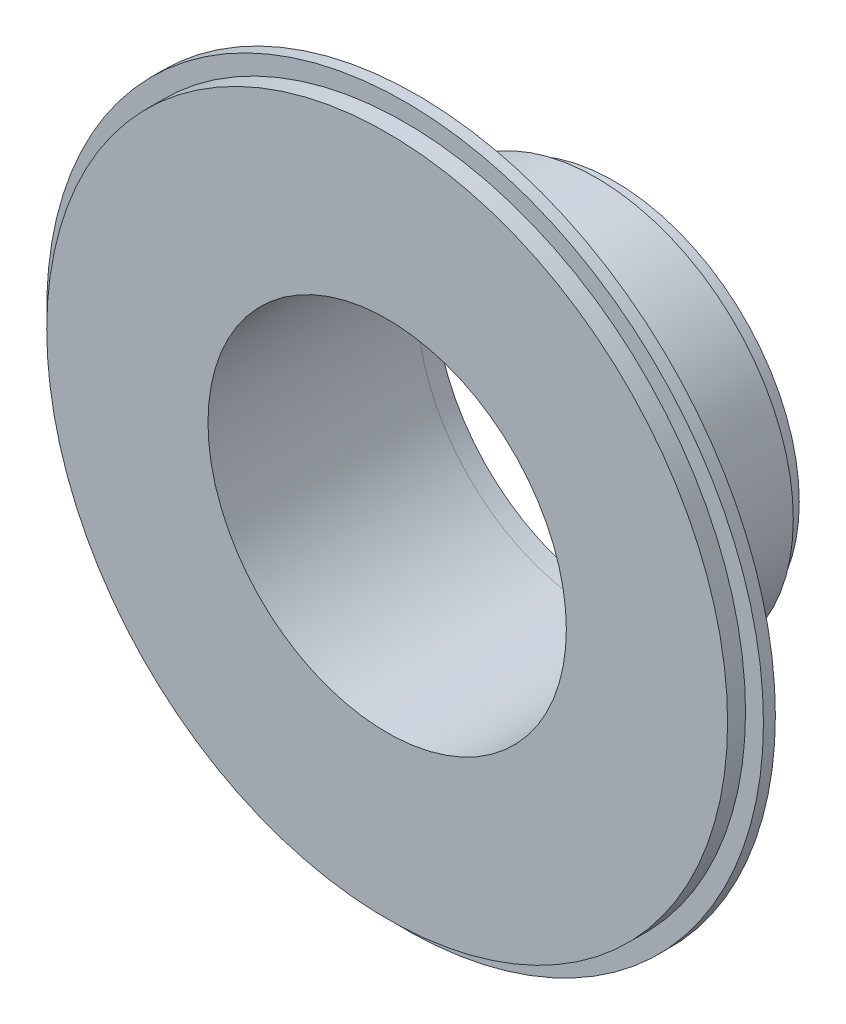
ISO-10303-21;
HEADER;
FILE_DESCRIPTION(('STEP AP214'),'2;1');
FILE_NAME('part.step','',(''),(''),'','','');
FILE_SCHEMA(('AUTOMOTIVE_DESIGN { 1 0 10303 214 1 1 1 1 }'));
ENDSEC;
DATA;
#1=APPLICATION_CONTEXT('core data for automotive mechanical design processes');
#2=APPLICATION_PROTOCOL_DEFINITION('international standard','automotive_design',2000,#1);
#3=PRODUCT_CONTEXT('',#1,'mechanical');
#4=PRODUCT('Part','Part','',(#3));
#5=PRODUCT_RELATED_PRODUCT_CATEGORY('part','',(#4));
#6=PRODUCT_DEFINITION_FORMATION('','',#4);
#7=PRODUCT_DEFINITION_CONTEXT('part definition',#1,'design');
#8=PRODUCT_DEFINITION('design','',#6,#7);
#9=PRODUCT_DEFINITION_SHAPE('','',#8);
#10=(LENGTH_UNIT() NAMED_UNIT(*) SI_UNIT(.MILLI.,.METRE.));
#11=(NAMED_UNIT(*) PLANE_ANGLE_UNIT() SI_UNIT($,.RADIAN.));
#12=(NAMED_UNIT(*) SI_UNIT($,.STERADIAN.) SOLID_ANGLE_UNIT());
#13=UNCERTAINTY_MEASURE_WITH_UNIT(LENGTH_MEASURE(1.E-05),#10,'distance_accuracy_value','');
#14=(GEOMETRIC_REPRESENTATION_CONTEXT(3) GLOBAL_UNCERTAINTY_ASSIGNED_CONTEXT((#13)) GLOBAL_UNIT_ASSIGNED_CONTEXT((#10,
#11,#12)) REPRESENTATION_CONTEXT('',''));
#15=CARTESIAN_POINT('',(0.,0.,0.));
#16=DIRECTION('',(0.,0.,1.));
#17=DIRECTION('',(1.,0.,0.));
#18=AXIS2_PLACEMENT_3D('',#15,#16,#17);
#19=CARTESIAN_POINT('',(0.,0.,35.));
#20=DIRECTION('',(0.,0.,-1.));
#21=DIRECTION('',(-1.,0.,0.));
#22=AXIS2_PLACEMENT_3D('',#19,#20,#21);
#23=CYLINDRICAL_SURFACE('',#22,60.);
#24=CARTESIAN_POINT('',(0.,0.,30.));
#25=DIRECTION('',(0.,0.,1.));
#26=DIRECTION('',(1.,0.,0.));
#27=AXIS2_PLACEMENT_3D('',#24,#25,#26);
#28=CIRCLE('',#27,60.);
#29=CARTESIAN_POINT('',(60.,0.,30.));
#30=VERTEX_POINT('',#29);
#31=EDGE_CURVE('E62',#30,#30,#28,.T.);
#32=ORIENTED_EDGE('',*,*,#31,.T.);
#33=EDGE_LOOP('',(#32));
#34=FACE_BOUND('',#33,.T.);
#35=CARTESIAN_POINT('',(0.,0.,32.));
#36=DIRECTION('',(0.,0.,1.));
#37=DIRECTION('',(1.,0.,0.));
#38=AXIS2_PLACEMENT_3D('',#35,#36,#37);
#39=CIRCLE('',#38,60.);
#40=CARTESIAN_POINT('',(60.,0.,32.));
#41=VERTEX_POINT('',#40);
#42=EDGE_CURVE('E72',#41,#41,#39,.T.);
#43=ORIENTED_EDGE('',*,*,#42,.F.);
#44=EDGE_LOOP('',(#43));
#45=FACE_BOUND('',#44,.T.);
#46=ADVANCED_FACE('F48',(#34,#45),#23,.T.);
#47=CARTESIAN_POINT('',(0.,0.,35.));
#48=DIRECTION('',(0.,0.,1.));
#49=DIRECTION('',(1.,0.,0.));
#50=AXIS2_PLACEMENT_3D('',#47,#48,#49);
#51=PLANE('',#50);
#52=CARTESIAN_POINT('',(0.,0.,35.));
#53=DIRECTION('',(0.,0.,1.));
#54=DIRECTION('',(1.,0.,0.));
#55=AXIS2_PLACEMENT_3D('',#52,#53,#54);
#56=CIRCLE('',#55,30.);
#57=CARTESIAN_POINT('',(30.,0.,35.));
#58=VERTEX_POINT('',#57);
#59=EDGE_CURVE('E65',#58,#58,#56,.F.);
#60=ORIENTED_EDGE('',*,*,#59,.T.);
#61=EDGE_LOOP('',(#60));
#62=FACE_BOUND('',#61,.T.);
#63=CARTESIAN_POINT('',(0.,0.,35.));
#64=DIRECTION('',(0.,0.,1.));
#65=DIRECTION('',(1.,0.,0.));
#66=AXIS2_PLACEMENT_3D('',#63,#64,#65);
#67=CIRCLE('',#66,57.);
#68=CARTESIAN_POINT('',(57.,0.,35.));
#69=VERTEX_POINT('',#68);
#70=EDGE_CURVE('E77',#69,#69,#67,.T.);
#71=ORIENTED_EDGE('',*,*,#70,.T.);
#72=EDGE_LOOP('',(#71));
#73=FACE_BOUND('',#72,.T.);
#74=ADVANCED_FACE('F94',(#62,#73),#51,.T.);
#75=CARTESIAN_POINT('',(0.,0.,30.));
#76=DIRECTION('',(0.,0.,-1.));
#77=DIRECTION('',(-1.,0.,0.));
#78=AXIS2_PLACEMENT_3D('',#75,#76,#77);
#79=CYLINDRICAL_SURFACE('',#78,33.);
#80=CARTESIAN_POINT('',(0.,0.,30.));
#81=DIRECTION('',(0.,0.,1.));
#82=DIRECTION('',(1.,0.,0.));
#83=AXIS2_PLACEMENT_3D('',#80,#81,#82);
#84=CIRCLE('',#83,33.);
#85=CARTESIAN_POINT('',(33.,0.,30.));
#86=VERTEX_POINT('',#85);
#87=EDGE_CURVE('E12',#86,#86,#84,.T.);
#88=ORIENTED_EDGE('',*,*,#87,.F.);
#89=EDGE_LOOP('',(#88));
#90=FACE_BOUND('',#89,.T.);
#91=CARTESIAN_POINT('',(0.,0.,0.));
#92=DIRECTION('',(0.,0.,1.));
#93=DIRECTION('',(1.,0.,0.));
#94=AXIS2_PLACEMENT_3D('',#91,#92,#93);
#95=CIRCLE('',#94,33.);
#96=CARTESIAN_POINT('',(33.,0.,0.));
#97=VERTEX_POINT('',#96);
#98=EDGE_CURVE('E60',#97,#97,#95,.T.);
#99=ORIENTED_EDGE('',*,*,#98,.T.);
#100=EDGE_LOOP('',(#99));
#101=FACE_BOUND('',#100,.T.);
#102=ADVANCED_FACE('F50',(#90,#101),#79,.T.);
#103=CARTESIAN_POINT('',(0.,0.,30.));
#104=DIRECTION('',(0.,0.,-1.));
#105=DIRECTION('',(-1.,0.,0.));
#106=AXIS2_PLACEMENT_3D('',#103,#104,#105);
#107=CYLINDRICAL_SURFACE('',#106,30.);
#108=CARTESIAN_POINT('',(0.,0.,0.));
#109=DIRECTION('',(0.,0.,1.));
#110=DIRECTION('',(1.,0.,0.));
#111=AXIS2_PLACEMENT_3D('',#108,#109,#110);
#112=CIRCLE('',#111,30.);
#113=CARTESIAN_POINT('',(30.,0.,0.));
#114=VERTEX_POINT('',#113);
#115=EDGE_CURVE('E52',#114,#114,#112,.F.);
#116=ORIENTED_EDGE('',*,*,#115,.T.);
#117=EDGE_LOOP('',(#116));
#118=FACE_BOUND('',#117,.T.);
#119=ORIENTED_EDGE('',*,*,#59,.F.);
#120=EDGE_LOOP('',(#119));
#121=FACE_BOUND('',#120,.T.);
#122=ADVANCED_FACE('F105',(#118,#121),#107,.F.);
#123=CARTESIAN_POINT('',(0.,0.,0.));
#124=DIRECTION('',(0.,0.,1.));
#125=DIRECTION('',(1.,0.,0.));
#126=AXIS2_PLACEMENT_3D('',#123,#124,#125);
#127=PLANE('',#126);
#128=ORIENTED_EDGE('',*,*,#98,.F.);
#129=EDGE_LOOP('',(#128));
#130=FACE_BOUND('',#129,.T.);
#131=ORIENTED_EDGE('',*,*,#115,.F.);
#132=EDGE_LOOP('',(#131));
#133=FACE_BOUND('',#132,.T.);
#134=ADVANCED_FACE('F103',(#130,#133),#127,.F.);
#135=CARTESIAN_POINT('',(0.,0.,30.));
#136=DIRECTION('',(0.,0.,1.));
#137=DIRECTION('',(1.,0.,0.));
#138=AXIS2_PLACEMENT_3D('',#135,#136,#137);
#139=PLANE('',#138);
#140=ORIENTED_EDGE('',*,*,#87,.T.);
#141=EDGE_LOOP('',(#140));
#142=FACE_BOUND('',#141,.T.);
#143=ORIENTED_EDGE('',*,*,#31,.F.);
#144=EDGE_LOOP('',(#143));
#145=FACE_BOUND('',#144,.T.);
#146=ADVANCED_FACE('F89',(#142,#145),#139,.F.);
#147=CARTESIAN_POINT('',(0.,0.,32.));
#148=DIRECTION('',(0.,0.,1.));
#149=DIRECTION('',(1.,0.,0.));
#150=AXIS2_PLACEMENT_3D('',#147,#148,#149);
#151=PLANE('',#150);
#152=CARTESIAN_POINT('',(0.,0.,32.));
#153=DIRECTION('',(0.,0.,1.));
#154=DIRECTION('',(1.,0.,0.));
#155=AXIS2_PLACEMENT_3D('',#152,#153,#154);
#156=CIRCLE('',#155,57.);
#157=CARTESIAN_POINT('',(57.,0.,32.));
#158=VERTEX_POINT('',#157);
#159=EDGE_CURVE('E76',#158,#158,#156,.T.);
#160=ORIENTED_EDGE('',*,*,#159,.F.);
#161=EDGE_LOOP('',(#160));
#162=FACE_BOUND('',#161,.T.);
#163=ORIENTED_EDGE('',*,*,#42,.T.);
#164=EDGE_LOOP('',(#163));
#165=FACE_BOUND('',#164,.T.);
#166=ADVANCED_FACE('F86',(#162,#165),#151,.T.);
#167=CARTESIAN_POINT('',(0.,0.,32.));
#168=DIRECTION('',(0.,0.,1.));
#169=DIRECTION('',(1.,0.,0.));
#170=AXIS2_PLACEMENT_3D('',#167,#168,#169);
#171=CYLINDRICAL_SURFACE('',#170,57.);
#172=ORIENTED_EDGE('',*,*,#159,.T.);
#173=EDGE_LOOP('',(#172));
#174=FACE_BOUND('',#173,.T.);
#175=ORIENTED_EDGE('',*,*,#70,.F.);
#176=EDGE_LOOP('',(#175));
#177=FACE_BOUND('',#176,.T.);
#178=ADVANCED_FACE('F83',(#174,#177),#171,.T.);
#179=CLOSED_SHELL('',(#46,#74,#102,#122,#134,#146,#166,#178));
#180=MANIFOLD_SOLID_BREP('B2',#179);
#181=CARTESIAN_POINT('',(0.,0.,-3.));
#182=DIRECTION('',(0.,0.,1.));
#183=DIRECTION('',(1.,0.,0.));
#184=AXIS2_PLACEMENT_3D('',#181,#182,#183);
#185=CYLINDRICAL_SURFACE('',#184,31.);
#186=CARTESIAN_POINT('',(0.,0.,-3.));
#187=DIRECTION('',(0.,0.,1.));
#188=DIRECTION('',(1.,0.,0.));
#189=AXIS2_PLACEMENT_3D('',#186,#187,#188);
#190=CIRCLE('',#189,31.);
#191=CARTESIAN_POINT('',(31.,0.,-3.));
#192=VERTEX_POINT('',#191);
#193=EDGE_CURVE('E47',#192,#192,#190,.T.);
#194=ORIENTED_EDGE('',*,*,#193,.T.);
#195=EDGE_LOOP('',(#194));
#196=FACE_BOUND('',#195,.T.);
#197=CARTESIAN_POINT('',(0.,0.,0.));
#198=DIRECTION('',(0.,0.,1.));
#199=DIRECTION('',(1.,0.,0.));
#200=AXIS2_PLACEMENT_3D('',#197,#198,#199);
#201=CIRCLE('',#200,31.);
#202=CARTESIAN_POINT('',(31.,0.,0.));
#203=VERTEX_POINT('',#202);
#204=EDGE_CURVE('E190',#203,#203,#201,.T.);
#205=ORIENTED_EDGE('',*,*,#204,.F.);
#206=EDGE_LOOP('',(#205));
#207=FACE_BOUND('',#206,.T.);
#208=ADVANCED_FACE('F187',(#196,#207),#185,.T.);
#209=CARTESIAN_POINT('',(0.,0.,-3.));
#210=DIRECTION('',(0.,0.,1.));
#211=DIRECTION('',(1.,0.,0.));
#212=AXIS2_PLACEMENT_3D('',#209,#210,#211);
#213=PLANE('',#212);
#214=CARTESIAN_POINT('',(0.,0.,-3.));
#215=DIRECTION('',(0.,0.,1.));
#216=DIRECTION('',(1.,0.,0.));
#217=AXIS2_PLACEMENT_3D('',#214,#215,#216);
#218=CIRCLE('',#217,30.);
#219=CARTESIAN_POINT('',(30.,0.,-3.));
#220=VERTEX_POINT('',#219);
#221=EDGE_CURVE('E197',#220,#220,#218,.T.);
#222=ORIENTED_EDGE('',*,*,#221,.T.);
#223=EDGE_LOOP('',(#222));
#224=FACE_BOUND('',#223,.T.);
#225=ORIENTED_EDGE('',*,*,#193,.F.);
#226=EDGE_LOOP('',(#225));
#227=FACE_BOUND('',#226,.T.);
#228=ADVANCED_FACE('F205',(#224,#227),#213,.F.);
#229=CARTESIAN_POINT('',(0.,0.,0.));
#230=DIRECTION('',(0.,0.,1.));
#231=DIRECTION('',(1.,0.,0.));
#232=AXIS2_PLACEMENT_3D('',#229,#230,#231);
#233=PLANE('',#232);
#234=CARTESIAN_POINT('',(0.,0.,0.));
#235=DIRECTION('',(0.,0.,1.));
#236=DIRECTION('',(1.,0.,0.));
#237=AXIS2_PLACEMENT_3D('',#234,#235,#236);
#238=CIRCLE('',#237,30.);
#239=CARTESIAN_POINT('',(30.,0.,0.));
#240=VERTEX_POINT('',#239);
#241=EDGE_CURVE('E199',#240,#240,#238,.T.);
#242=ORIENTED_EDGE('',*,*,#241,.F.);
#243=EDGE_LOOP('',(#242));
#244=FACE_BOUND('',#243,.T.);
#245=ORIENTED_EDGE('',*,*,#204,.T.);
#246=EDGE_LOOP('',(#245));
#247=FACE_BOUND('',#246,.T.);
#248=ADVANCED_FACE('F211',(#244,#247),#233,.T.);
#249=CARTESIAN_POINT('',(0.,0.,-3.));
#250=DIRECTION('',(0.,0.,1.));
#251=DIRECTION('',(1.,0.,0.));
#252=AXIS2_PLACEMENT_3D('',#249,#250,#251);
#253=CYLINDRICAL_SURFACE('',#252,30.);
#254=ORIENTED_EDGE('',*,*,#221,.F.);
#255=EDGE_LOOP('',(#254));
#256=FACE_BOUND('',#255,.T.);
#257=ORIENTED_EDGE('',*,*,#241,.T.);
#258=EDGE_LOOP('',(#257));
#259=FACE_BOUND('',#258,.T.);
#260=ADVANCED_FACE('F208',(#256,#259),#253,.F.);
#261=CLOSED_SHELL('',(#208,#228,#248,#260));
#262=MANIFOLD_SOLID_BREP('B7',#261);
#263=ADVANCED_BREP_SHAPE_REPRESENTATION('',(#18,#180,#262),#14);
#264=SHAPE_DEFINITION_REPRESENTATION(#9,#263);
ENDSEC;
END-ISO-10303-21;
